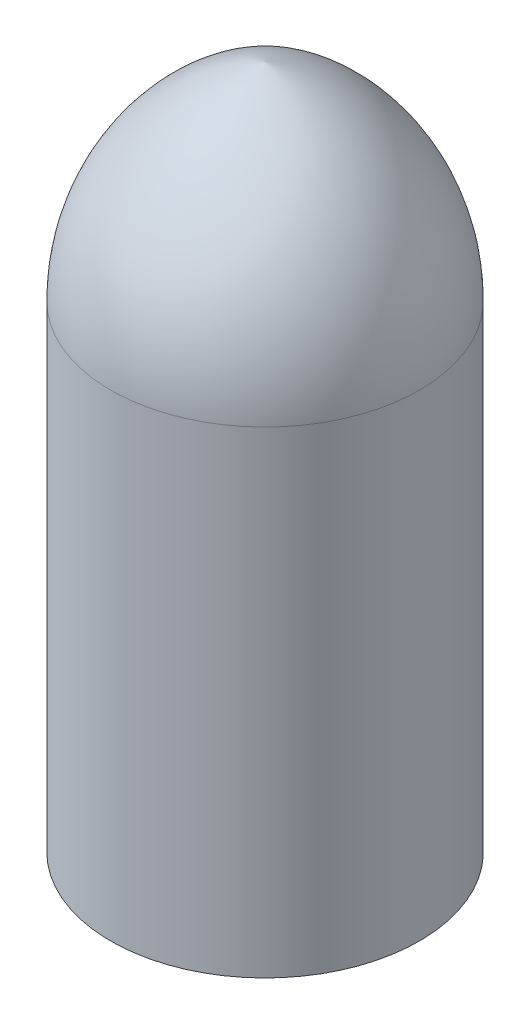
ISO-10303-21;
HEADER;
FILE_DESCRIPTION(('STEP AP214'),'2;1');
FILE_NAME('part.step','',(''),(''),'','','');
FILE_SCHEMA(('AUTOMOTIVE_DESIGN { 1 0 10303 214 1 1 1 1 }'));
ENDSEC;
DATA;
#1=APPLICATION_CONTEXT('core data for automotive mechanical design processes');
#2=APPLICATION_PROTOCOL_DEFINITION('international standard','automotive_design',2000,#1);
#3=PRODUCT_CONTEXT('',#1,'mechanical');
#4=PRODUCT('Part','Part','',(#3));
#5=PRODUCT_RELATED_PRODUCT_CATEGORY('part','',(#4));
#6=PRODUCT_DEFINITION_FORMATION('','',#4);
#7=PRODUCT_DEFINITION_CONTEXT('part definition',#1,'design');
#8=PRODUCT_DEFINITION('design','',#6,#7);
#9=PRODUCT_DEFINITION_SHAPE('','',#8);
#10=(LENGTH_UNIT() NAMED_UNIT(*) SI_UNIT(.MILLI.,.METRE.));
#11=(NAMED_UNIT(*) PLANE_ANGLE_UNIT() SI_UNIT($,.RADIAN.));
#12=(NAMED_UNIT(*) SI_UNIT($,.STERADIAN.) SOLID_ANGLE_UNIT());
#13=UNCERTAINTY_MEASURE_WITH_UNIT(LENGTH_MEASURE(1.E-05),#10,'distance_accuracy_value','');
#14=(GEOMETRIC_REPRESENTATION_CONTEXT(3) GLOBAL_UNCERTAINTY_ASSIGNED_CONTEXT((#13)) GLOBAL_UNIT_ASSIGNED_CONTEXT((#10,
#11,#12)) REPRESENTATION_CONTEXT('',''));
#15=CARTESIAN_POINT('',(0.,0.,0.));
#16=DIRECTION('',(0.,0.,1.));
#17=DIRECTION('',(1.,0.,0.));
#18=AXIS2_PLACEMENT_3D('',#15,#16,#17);
#19=CARTESIAN_POINT('',(0.,170.,21.9590163934427));
#20=DIRECTION('',(-1.,0.,0.));
#21=DIRECTION('',(0.,0.,-1.));
#22=AXIS2_PLACEMENT_3D('',#19,#20,#21);
#23=CIRCLE('',#22,73.9590163934426);
#24=TRIMMED_CURVE('',#23,(PARAMETER_VALUE(-1.26934342744464)),
(PARAMETER_VALUE(1.26934342744464)),.T.,.PARAMETER.);
#25=CARTESIAN_POINT('',(0.,170.,0.));
#26=DIRECTION('',(0.,-1.,0.));
#27=AXIS1_PLACEMENT('',#25,#26);
#28=SURFACE_OF_REVOLUTION('',#24,#27);
#29=CARTESIAN_POINT('',(0.,240.623917371653,0.));
#30=VERTEX_POINT('',#29);
#31=VERTEX_LOOP('',#30);
#32=FACE_BOUND('',#31,.T.);
#33=CARTESIAN_POINT('',(0.,170.,0.));
#34=DIRECTION('',(0.,-1.,0.));
#35=DIRECTION('',(0.,0.,-1.));
#36=AXIS2_PLACEMENT_3D('',#33,#34,#35);
#37=CIRCLE('',#36,52.);
#38=CARTESIAN_POINT('',(0.,170.,-52.));
#39=VERTEX_POINT('',#38);
#40=EDGE_CURVE('E11',#39,#39,#37,.T.);
#41=ORIENTED_EDGE('',*,*,#40,.T.);
#42=EDGE_LOOP('',(#41));
#43=FACE_BOUND('',#42,.T.);
#44=ADVANCED_FACE('F35',(#32,#43),#28,.F.);
#45=CARTESIAN_POINT('',(0.,240.623917371653,0.));
#46=DIRECTION('',(0.,-1.,0.));
#47=DIRECTION('',(0.,0.,-1.));
#48=AXIS2_PLACEMENT_3D('',#45,#46,#47);
#49=CYLINDRICAL_SURFACE('',#48,52.);
#50=ORIENTED_EDGE('',*,*,#40,.F.);
#51=EDGE_LOOP('',(#50));
#52=FACE_BOUND('',#51,.T.);
#53=CARTESIAN_POINT('',(0.,0.,0.));
#54=DIRECTION('',(0.,-1.,0.));
#55=DIRECTION('',(0.,0.,-1.));
#56=AXIS2_PLACEMENT_3D('',#53,#54,#55);
#57=CIRCLE('',#56,52.);
#58=CARTESIAN_POINT('',(0.,0.,-52.));
#59=VERTEX_POINT('',#58);
#60=EDGE_CURVE('E42',#59,#59,#57,.T.);
#61=ORIENTED_EDGE('',*,*,#60,.T.);
#62=EDGE_LOOP('',(#61));
#63=FACE_BOUND('',#62,.T.);
#64=ADVANCED_FACE('F64',(#52,#63),#49,.F.);
#65=CARTESIAN_POINT('',(0.,0.,0.));
#66=DIRECTION('',(0.,-1.,0.));
#67=DIRECTION('',(0.,0.,-1.));
#68=AXIS2_PLACEMENT_3D('',#65,#66,#67);
#69=PLANE('',#68);
#70=CARTESIAN_POINT('',(0.,0.,0.));
#71=DIRECTION('',(0.,-1.,0.));
#72=DIRECTION('',(0.,0.,-1.));
#73=AXIS2_PLACEMENT_3D('',#70,#71,#72);
#74=CIRCLE('',#73,55.);
#75=CARTESIAN_POINT('',(0.,0.,-55.));
#76=VERTEX_POINT('',#75);
#77=EDGE_CURVE('E57',#76,#76,#74,.T.);
#78=ORIENTED_EDGE('',*,*,#77,.T.);
#79=EDGE_LOOP('',(#78));
#80=FACE_BOUND('',#79,.T.);
#81=ORIENTED_EDGE('',*,*,#60,.F.);
#82=EDGE_LOOP('',(#81));
#83=FACE_BOUND('',#82,.T.);
#84=ADVANCED_FACE('F66',(#80,#83),#69,.T.);
#85=CARTESIAN_POINT('',(0.,240.623917371653,0.));
#86=DIRECTION('',(0.,-1.,0.));
#87=DIRECTION('',(0.,0.,-1.));
#88=AXIS2_PLACEMENT_3D('',#85,#86,#87);
#89=CYLINDRICAL_SURFACE('',#88,55.);
#90=CARTESIAN_POINT('',(0.,170.,0.));
#91=DIRECTION('',(0.,-1.,0.));
#92=DIRECTION('',(0.,0.,-1.));
#93=AXIS2_PLACEMENT_3D('',#90,#91,#92);
#94=CIRCLE('',#93,55.);
#95=CARTESIAN_POINT('',(0.,170.,-55.));
#96=VERTEX_POINT('',#95);
#97=EDGE_CURVE('E55',#96,#96,#94,.T.);
#98=ORIENTED_EDGE('',*,*,#97,.T.);
#99=EDGE_LOOP('',(#98));
#100=FACE_BOUND('',#99,.T.);
#101=ORIENTED_EDGE('',*,*,#77,.F.);
#102=EDGE_LOOP('',(#101));
#103=FACE_BOUND('',#102,.T.);
#104=ADVANCED_FACE('F51',(#100,#103),#89,.T.);
#105=CARTESIAN_POINT('',(0.,170.,21.9590163934427));
#106=DIRECTION('',(-1.,0.,0.));
#107=DIRECTION('',(0.,0.,-1.));
#108=AXIS2_PLACEMENT_3D('',#105,#106,#107);
#109=CIRCLE('',#108,76.9590163934427);
#110=TRIMMED_CURVE('',#109,(PARAMETER_VALUE(-1.28144153233185)),
(PARAMETER_VALUE(1.28144153233185)),.T.,.PARAMETER.);
#111=CARTESIAN_POINT('',(0.,170.,0.));
#112=DIRECTION('',(0.,-1.,0.));
#113=AXIS1_PLACEMENT('',#111,#112);
#114=SURFACE_OF_REVOLUTION('',#110,#113);
#115=CARTESIAN_POINT('',(0.,243.759689555195,0.));
#116=VERTEX_POINT('',#115);
#117=VERTEX_LOOP('',#116);
#118=FACE_BOUND('',#117,.T.);
#119=ORIENTED_EDGE('',*,*,#97,.F.);
#120=EDGE_LOOP('',(#119));
#121=FACE_BOUND('',#120,.T.);
#122=ADVANCED_FACE('F48',(#118,#121),#114,.T.);
#123=CLOSED_SHELL('',(#44,#64,#84,#104,#122));
#124=MANIFOLD_SOLID_BREP('B2',#123);
#125=ADVANCED_BREP_SHAPE_REPRESENTATION('',(#18,#124),#14);
#126=SHAPE_DEFINITION_REPRESENTATION(#9,#125);
ENDSEC;
END-ISO-10303-21;
